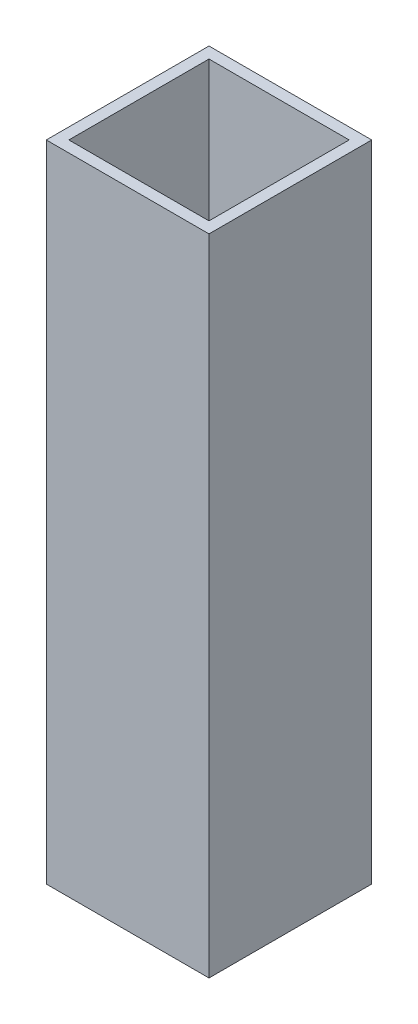
ISO-10303-21;
HEADER;
FILE_DESCRIPTION(('STEP AP214'),'2;1');
FILE_NAME('part.step','',(''),(''),'','','');
FILE_SCHEMA(('AUTOMOTIVE_DESIGN { 1 0 10303 214 1 1 1 1 }'));
ENDSEC;
DATA;
#1=APPLICATION_CONTEXT('core data for automotive mechanical design processes');
#2=APPLICATION_PROTOCOL_DEFINITION('international standard','automotive_design',2000,#1);
#3=PRODUCT_CONTEXT('',#1,'mechanical');
#4=PRODUCT('Part','Part','',(#3));
#5=PRODUCT_RELATED_PRODUCT_CATEGORY('part','',(#4));
#6=PRODUCT_DEFINITION_FORMATION('','',#4);
#7=PRODUCT_DEFINITION_CONTEXT('part definition',#1,'design');
#8=PRODUCT_DEFINITION('design','',#6,#7);
#9=PRODUCT_DEFINITION_SHAPE('','',#8);
#10=(LENGTH_UNIT() NAMED_UNIT(*) SI_UNIT(.MILLI.,.METRE.));
#11=(NAMED_UNIT(*) PLANE_ANGLE_UNIT() SI_UNIT($,.RADIAN.));
#12=(NAMED_UNIT(*) SI_UNIT($,.STERADIAN.) SOLID_ANGLE_UNIT());
#13=UNCERTAINTY_MEASURE_WITH_UNIT(LENGTH_MEASURE(1.E-05),#10,'distance_accuracy_value','');
#14=(GEOMETRIC_REPRESENTATION_CONTEXT(3) GLOBAL_UNCERTAINTY_ASSIGNED_CONTEXT((#13)) GLOBAL_UNIT_ASSIGNED_CONTEXT((#10,
#11,#12)) REPRESENTATION_CONTEXT('',''));
#15=CARTESIAN_POINT('',(0.,0.,0.));
#16=DIRECTION('',(0.,0.,1.));
#17=DIRECTION('',(1.,0.,0.));
#18=AXIS2_PLACEMENT_3D('',#15,#16,#17);
#19=CARTESIAN_POINT('',(0.,101.6,0.));
#20=DIRECTION('',(0.,-1.,0.));
#21=DIRECTION('',(0.,0.,-1.));
#22=AXIS2_PLACEMENT_3D('',#19,#20,#21);
#23=PLANE('',#22);
#24=DIRECTION('',(0.,0.,-1.));
#25=VECTOR('',#24,1.);
#26=CARTESIAN_POINT('',(12.827,101.6,12.827));
#27=LINE('',#26,#25);
#28=CARTESIAN_POINT('',(12.827,101.6,12.827));
#29=VERTEX_POINT('',#28);
#30=CARTESIAN_POINT('',(12.827,101.6,-12.827));
#31=VERTEX_POINT('',#30);
#32=EDGE_CURVE('E136',#29,#31,#27,.T.);
#33=ORIENTED_EDGE('',*,*,#32,.T.);
#34=DIRECTION('',(-1.,0.,0.));
#35=VECTOR('',#34,1.);
#36=CARTESIAN_POINT('',(-12.827,101.6,-12.827));
#37=LINE('',#36,#35);
#38=CARTESIAN_POINT('',(-12.827,101.6,-12.827));
#39=VERTEX_POINT('',#38);
#40=EDGE_CURVE('E139',#31,#39,#37,.T.);
#41=ORIENTED_EDGE('',*,*,#40,.T.);
#42=DIRECTION('',(0.,0.,1.));
#43=VECTOR('',#42,1.);
#44=CARTESIAN_POINT('',(-12.827,101.6,12.827));
#45=LINE('',#44,#43);
#46=CARTESIAN_POINT('',(-12.827,101.6,12.827));
#47=VERTEX_POINT('',#46);
#48=EDGE_CURVE('E142',#39,#47,#45,.T.);
#49=ORIENTED_EDGE('',*,*,#48,.T.);
#50=DIRECTION('',(1.,0.,0.));
#51=VECTOR('',#50,1.);
#52=CARTESIAN_POINT('',(-12.827,101.6,12.827));
#53=LINE('',#52,#51);
#54=EDGE_CURVE('E144',#47,#29,#53,.T.);
#55=ORIENTED_EDGE('',*,*,#54,.T.);
#56=EDGE_LOOP('',(#33,#41,#49,#55));
#57=FACE_BOUND('',#56,.T.);
#58=DIRECTION('',(0.,0.,-1.));
#59=VECTOR('',#58,1.);
#60=CARTESIAN_POINT('',(11.049,101.6,11.049));
#61=LINE('',#60,#59);
#62=CARTESIAN_POINT('',(11.049,101.6,11.049));
#63=VERTEX_POINT('',#62);
#64=CARTESIAN_POINT('',(11.049,101.6,-11.049));
#65=VERTEX_POINT('',#64);
#66=EDGE_CURVE('E100',#63,#65,#61,.T.);
#67=ORIENTED_EDGE('',*,*,#66,.F.);
#68=DIRECTION('',(1.,0.,0.));
#69=VECTOR('',#68,1.);
#70=CARTESIAN_POINT('',(-11.049,101.6,11.049));
#71=LINE('',#70,#69);
#72=CARTESIAN_POINT('',(-11.049,101.6,11.049));
#73=VERTEX_POINT('',#72);
#74=EDGE_CURVE('E122',#73,#63,#71,.T.);
#75=ORIENTED_EDGE('',*,*,#74,.F.);
#76=DIRECTION('',(0.,0.,1.));
#77=VECTOR('',#76,1.);
#78=CARTESIAN_POINT('',(-11.049,101.6,11.049));
#79=LINE('',#78,#77);
#80=CARTESIAN_POINT('',(-11.049,101.6,-11.049));
#81=VERTEX_POINT('',#80);
#82=EDGE_CURVE('E120',#81,#73,#79,.T.);
#83=ORIENTED_EDGE('',*,*,#82,.F.);
#84=DIRECTION('',(-1.,0.,0.));
#85=VECTOR('',#84,1.);
#86=CARTESIAN_POINT('',(-11.049,101.6,-11.049));
#87=LINE('',#86,#85);
#88=EDGE_CURVE('E108',#65,#81,#87,.T.);
#89=ORIENTED_EDGE('',*,*,#88,.F.);
#90=EDGE_LOOP('',(#67,#75,#83,#89));
#91=FACE_BOUND('',#90,.T.);
#92=ADVANCED_FACE('F35',(#57,#91),#23,.F.);
#93=CARTESIAN_POINT('',(0.,0.,0.));
#94=DIRECTION('',(0.,-1.,0.));
#95=DIRECTION('',(0.,0.,-1.));
#96=AXIS2_PLACEMENT_3D('',#93,#94,#95);
#97=PLANE('',#96);
#98=DIRECTION('',(0.,0.,-1.));
#99=VECTOR('',#98,1.);
#100=CARTESIAN_POINT('',(12.827,0.,12.827));
#101=LINE('',#100,#99);
#102=CARTESIAN_POINT('',(12.827,0.,12.827));
#103=VERTEX_POINT('',#102);
#104=CARTESIAN_POINT('',(12.827,0.,-12.827));
#105=VERTEX_POINT('',#104);
#106=EDGE_CURVE('E116',#103,#105,#101,.T.);
#107=ORIENTED_EDGE('',*,*,#106,.F.);
#108=DIRECTION('',(1.,0.,0.));
#109=VECTOR('',#108,1.);
#110=CARTESIAN_POINT('',(-12.827,0.,12.827));
#111=LINE('',#110,#109);
#112=CARTESIAN_POINT('',(-12.827,0.,12.827));
#113=VERTEX_POINT('',#112);
#114=EDGE_CURVE('E140',#113,#103,#111,.T.);
#115=ORIENTED_EDGE('',*,*,#114,.F.);
#116=DIRECTION('',(0.,0.,1.));
#117=VECTOR('',#116,1.);
#118=CARTESIAN_POINT('',(-12.827,0.,12.827));
#119=LINE('',#118,#117);
#120=CARTESIAN_POINT('',(-12.827,0.,-12.827));
#121=VERTEX_POINT('',#120);
#122=EDGE_CURVE('E151',#121,#113,#119,.T.);
#123=ORIENTED_EDGE('',*,*,#122,.F.);
#124=DIRECTION('',(-1.,0.,0.));
#125=VECTOR('',#124,1.);
#126=CARTESIAN_POINT('',(-12.827,0.,-12.827));
#127=LINE('',#126,#125);
#128=EDGE_CURVE('E149',#105,#121,#127,.T.);
#129=ORIENTED_EDGE('',*,*,#128,.F.);
#130=EDGE_LOOP('',(#107,#115,#123,#129));
#131=FACE_BOUND('',#130,.T.);
#132=DIRECTION('',(1.,0.,0.));
#133=VECTOR('',#132,1.);
#134=CARTESIAN_POINT('',(-11.049,0.,11.049));
#135=LINE('',#134,#133);
#136=CARTESIAN_POINT('',(-11.049,0.,11.049));
#137=VERTEX_POINT('',#136);
#138=CARTESIAN_POINT('',(11.049,0.,11.049));
#139=VERTEX_POINT('',#138);
#140=EDGE_CURVE('E109',#137,#139,#135,.T.);
#141=ORIENTED_EDGE('',*,*,#140,.T.);
#142=DIRECTION('',(0.,0.,-1.));
#143=VECTOR('',#142,1.);
#144=CARTESIAN_POINT('',(11.049,0.,11.049));
#145=LINE('',#144,#143);
#146=CARTESIAN_POINT('',(11.049,0.,-11.049));
#147=VERTEX_POINT('',#146);
#148=EDGE_CURVE('E58',#139,#147,#145,.T.);
#149=ORIENTED_EDGE('',*,*,#148,.T.);
#150=DIRECTION('',(-1.,0.,0.));
#151=VECTOR('',#150,1.);
#152=CARTESIAN_POINT('',(-11.049,0.,-11.049));
#153=LINE('',#152,#151);
#154=CARTESIAN_POINT('',(-11.049,0.,-11.049));
#155=VERTEX_POINT('',#154);
#156=EDGE_CURVE('E115',#147,#155,#153,.T.);
#157=ORIENTED_EDGE('',*,*,#156,.T.);
#158=DIRECTION('',(0.,0.,1.));
#159=VECTOR('',#158,1.);
#160=CARTESIAN_POINT('',(-11.049,0.,11.049));
#161=LINE('',#160,#159);
#162=EDGE_CURVE('E128',#155,#137,#161,.T.);
#163=ORIENTED_EDGE('',*,*,#162,.T.);
#164=EDGE_LOOP('',(#141,#149,#157,#163));
#165=FACE_BOUND('',#164,.T.);
#166=ADVANCED_FACE('F169',(#131,#165),#97,.T.);
#167=CARTESIAN_POINT('',(12.827,101.6,12.827));
#168=DIRECTION('',(-1.,0.,0.));
#169=DIRECTION('',(0.,0.,1.));
#170=AXIS2_PLACEMENT_3D('',#167,#168,#169);
#171=PLANE('',#170);
#172=ORIENTED_EDGE('',*,*,#106,.T.);
#173=DIRECTION('',(0.,-1.,0.));
#174=VECTOR('',#173,1.);
#175=CARTESIAN_POINT('',(12.827,101.6,-12.827));
#176=LINE('',#175,#174);
#177=EDGE_CURVE('E11',#31,#105,#176,.T.);
#178=ORIENTED_EDGE('',*,*,#177,.F.);
#179=ORIENTED_EDGE('',*,*,#32,.F.);
#180=DIRECTION('',(0.,-1.,0.));
#181=VECTOR('',#180,1.);
#182=CARTESIAN_POINT('',(12.827,101.6,12.827));
#183=LINE('',#182,#181);
#184=EDGE_CURVE('E146',#29,#103,#183,.T.);
#185=ORIENTED_EDGE('',*,*,#184,.T.);
#186=EDGE_LOOP('',(#172,#178,#179,#185));
#187=FACE_BOUND('',#186,.T.);
#188=ADVANCED_FACE('F37',(#187),#171,.F.);
#189=CARTESIAN_POINT('',(-12.827,101.6,-12.827));
#190=DIRECTION('',(0.,0.,1.));
#191=DIRECTION('',(1.,0.,0.));
#192=AXIS2_PLACEMENT_3D('',#189,#190,#191);
#193=PLANE('',#192);
#194=ORIENTED_EDGE('',*,*,#128,.T.);
#195=DIRECTION('',(0.,-1.,0.));
#196=VECTOR('',#195,1.);
#197=CARTESIAN_POINT('',(-12.827,101.6,-12.827));
#198=LINE('',#197,#196);
#199=EDGE_CURVE('E43',#39,#121,#198,.T.);
#200=ORIENTED_EDGE('',*,*,#199,.F.);
#201=ORIENTED_EDGE('',*,*,#40,.F.);
#202=ORIENTED_EDGE('',*,*,#177,.T.);
#203=EDGE_LOOP('',(#194,#200,#201,#202));
#204=FACE_BOUND('',#203,.T.);
#205=ADVANCED_FACE('F179',(#204),#193,.F.);
#206=CARTESIAN_POINT('',(-12.827,101.6,12.827));
#207=DIRECTION('',(1.,0.,0.));
#208=DIRECTION('',(0.,0.,-1.));
#209=AXIS2_PLACEMENT_3D('',#206,#207,#208);
#210=PLANE('',#209);
#211=ORIENTED_EDGE('',*,*,#122,.T.);
#212=DIRECTION('',(0.,-1.,0.));
#213=VECTOR('',#212,1.);
#214=CARTESIAN_POINT('',(-12.827,101.6,12.827));
#215=LINE('',#214,#213);
#216=EDGE_CURVE('E156',#47,#113,#215,.T.);
#217=ORIENTED_EDGE('',*,*,#216,.F.);
#218=ORIENTED_EDGE('',*,*,#48,.F.);
#219=ORIENTED_EDGE('',*,*,#199,.T.);
#220=EDGE_LOOP('',(#211,#217,#218,#219));
#221=FACE_BOUND('',#220,.T.);
#222=ADVANCED_FACE('F163',(#221),#210,.F.);
#223=CARTESIAN_POINT('',(-12.827,101.6,12.827));
#224=DIRECTION('',(0.,0.,-1.));
#225=DIRECTION('',(-1.,0.,0.));
#226=AXIS2_PLACEMENT_3D('',#223,#224,#225);
#227=PLANE('',#226);
#228=ORIENTED_EDGE('',*,*,#114,.T.);
#229=ORIENTED_EDGE('',*,*,#184,.F.);
#230=ORIENTED_EDGE('',*,*,#54,.F.);
#231=ORIENTED_EDGE('',*,*,#216,.T.);
#232=EDGE_LOOP('',(#228,#229,#230,#231));
#233=FACE_BOUND('',#232,.T.);
#234=ADVANCED_FACE('F173',(#233),#227,.F.);
#235=CARTESIAN_POINT('',(11.049,101.6,11.049));
#236=DIRECTION('',(-1.,0.,0.));
#237=DIRECTION('',(0.,0.,1.));
#238=AXIS2_PLACEMENT_3D('',#235,#236,#237);
#239=PLANE('',#238);
#240=ORIENTED_EDGE('',*,*,#148,.F.);
#241=DIRECTION('',(0.,-1.,0.));
#242=VECTOR('',#241,1.);
#243=CARTESIAN_POINT('',(11.049,101.6,11.049));
#244=LINE('',#243,#242);
#245=EDGE_CURVE('E104',#63,#139,#244,.T.);
#246=ORIENTED_EDGE('',*,*,#245,.F.);
#247=ORIENTED_EDGE('',*,*,#66,.T.);
#248=DIRECTION('',(0.,-1.,0.));
#249=VECTOR('',#248,1.);
#250=CARTESIAN_POINT('',(11.049,101.6,-11.049));
#251=LINE('',#250,#249);
#252=EDGE_CURVE('E103',#65,#147,#251,.T.);
#253=ORIENTED_EDGE('',*,*,#252,.T.);
#254=EDGE_LOOP('',(#240,#246,#247,#253));
#255=FACE_BOUND('',#254,.T.);
#256=ADVANCED_FACE('F102',(#255),#239,.T.);
#257=CARTESIAN_POINT('',(-11.049,101.6,-11.049));
#258=DIRECTION('',(0.,0.,1.));
#259=DIRECTION('',(1.,0.,0.));
#260=AXIS2_PLACEMENT_3D('',#257,#258,#259);
#261=PLANE('',#260);
#262=ORIENTED_EDGE('',*,*,#156,.F.);
#263=ORIENTED_EDGE('',*,*,#252,.F.);
#264=ORIENTED_EDGE('',*,*,#88,.T.);
#265=DIRECTION('',(0.,-1.,0.));
#266=VECTOR('',#265,1.);
#267=CARTESIAN_POINT('',(-11.049,101.6,-11.049));
#268=LINE('',#267,#266);
#269=EDGE_CURVE('E117',#81,#155,#268,.T.);
#270=ORIENTED_EDGE('',*,*,#269,.T.);
#271=EDGE_LOOP('',(#262,#263,#264,#270));
#272=FACE_BOUND('',#271,.T.);
#273=ADVANCED_FACE('F112',(#272),#261,.T.);
#274=CARTESIAN_POINT('',(-11.049,101.6,11.049));
#275=DIRECTION('',(1.,0.,0.));
#276=DIRECTION('',(0.,0.,-1.));
#277=AXIS2_PLACEMENT_3D('',#274,#275,#276);
#278=PLANE('',#277);
#279=ORIENTED_EDGE('',*,*,#162,.F.);
#280=ORIENTED_EDGE('',*,*,#269,.F.);
#281=ORIENTED_EDGE('',*,*,#82,.T.);
#282=DIRECTION('',(0.,-1.,0.));
#283=VECTOR('',#282,1.);
#284=CARTESIAN_POINT('',(-11.049,101.6,11.049));
#285=LINE('',#284,#283);
#286=EDGE_CURVE('E50',#73,#137,#285,.T.);
#287=ORIENTED_EDGE('',*,*,#286,.T.);
#288=EDGE_LOOP('',(#279,#280,#281,#287));
#289=FACE_BOUND('',#288,.T.);
#290=ADVANCED_FACE('F202',(#289),#278,.T.);
#291=CARTESIAN_POINT('',(-11.049,101.6,11.049));
#292=DIRECTION('',(0.,0.,-1.));
#293=DIRECTION('',(-1.,0.,0.));
#294=AXIS2_PLACEMENT_3D('',#291,#292,#293);
#295=PLANE('',#294);
#296=ORIENTED_EDGE('',*,*,#140,.F.);
#297=ORIENTED_EDGE('',*,*,#286,.F.);
#298=ORIENTED_EDGE('',*,*,#74,.T.);
#299=ORIENTED_EDGE('',*,*,#245,.T.);
#300=EDGE_LOOP('',(#296,#297,#298,#299));
#301=FACE_BOUND('',#300,.T.);
#302=ADVANCED_FACE('F206',(#301),#295,.T.);
#303=CLOSED_SHELL('',(#92,#166,#188,#205,#222,#234,#256,#273,#290,#302));
#304=MANIFOLD_SOLID_BREP('B2',#303);
#305=ADVANCED_BREP_SHAPE_REPRESENTATION('',(#18,#304),#14);
#306=SHAPE_DEFINITION_REPRESENTATION(#9,#305);
ENDSEC;
END-ISO-10303-21;
